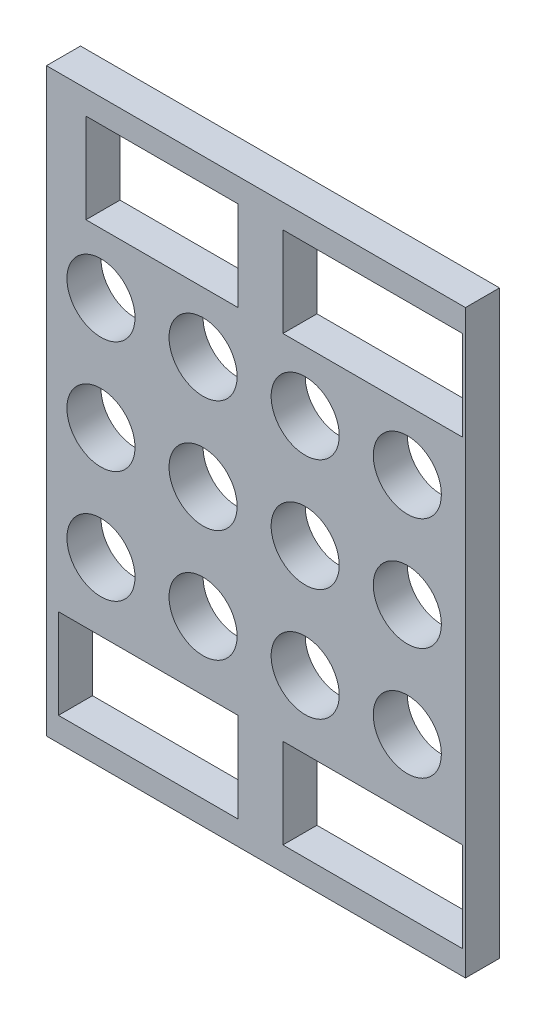
ISO-10303-21;
HEADER;
FILE_DESCRIPTION(('STEP AP214'),'2;1');
FILE_NAME('part.step','',(''),(''),'','','');
FILE_SCHEMA(('AUTOMOTIVE_DESIGN { 1 0 10303 214 1 1 1 1 }'));
ENDSEC;
DATA;
#1=APPLICATION_CONTEXT('core data for automotive mechanical design processes');
#2=APPLICATION_PROTOCOL_DEFINITION('international standard','automotive_design',2000,#1);
#3=PRODUCT_CONTEXT('',#1,'mechanical');
#4=PRODUCT('Part','Part','',(#3));
#5=PRODUCT_RELATED_PRODUCT_CATEGORY('part','',(#4));
#6=PRODUCT_DEFINITION_FORMATION('','',#4);
#7=PRODUCT_DEFINITION_CONTEXT('part definition',#1,'design');
#8=PRODUCT_DEFINITION('design','',#6,#7);
#9=PRODUCT_DEFINITION_SHAPE('','',#8);
#10=(LENGTH_UNIT() NAMED_UNIT(*) SI_UNIT(.MILLI.,.METRE.));
#11=(NAMED_UNIT(*) PLANE_ANGLE_UNIT() SI_UNIT($,.RADIAN.));
#12=(NAMED_UNIT(*) SI_UNIT($,.STERADIAN.) SOLID_ANGLE_UNIT());
#13=UNCERTAINTY_MEASURE_WITH_UNIT(LENGTH_MEASURE(1.E-05),#10,'distance_accuracy_value','');
#14=(GEOMETRIC_REPRESENTATION_CONTEXT(3) GLOBAL_UNCERTAINTY_ASSIGNED_CONTEXT((#13)) GLOBAL_UNIT_ASSIGNED_CONTEXT((#10,
#11,#12)) REPRESENTATION_CONTEXT('',''));
#15=CARTESIAN_POINT('',(0.,0.,0.));
#16=DIRECTION('',(0.,0.,1.));
#17=DIRECTION('',(1.,0.,0.));
#18=AXIS2_PLACEMENT_3D('',#15,#16,#17);
#19=CARTESIAN_POINT('',(0.,0.,5.));
#20=DIRECTION('',(0.,0.,1.));
#21=DIRECTION('',(1.,0.,0.));
#22=AXIS2_PLACEMENT_3D('',#19,#20,#21);
#23=PLANE('',#22);
#24=CARTESIAN_POINT('',(261.469054235882,375.54602981814,5.));
#25=DIRECTION('',(0.,0.,1.));
#26=DIRECTION('',(1.,0.,0.));
#27=AXIS2_PLACEMENT_3D('',#24,#25,#26);
#28=CIRCLE('',#27,4.99999999999999);
#29=CARTESIAN_POINT('',(266.469054235882,375.54602981814,5.));
#30=VERTEX_POINT('',#29);
#31=EDGE_CURVE('E457',#30,#30,#28,.T.);
#32=ORIENTED_EDGE('',*,*,#31,.F.);
#33=EDGE_LOOP('',(#32));
#34=FACE_BOUND('',#33,.T.);
#35=CARTESIAN_POINT('',(231.469054235882,375.54602981814,5.));
#36=DIRECTION('',(0.,0.,1.));
#37=DIRECTION('',(1.,0.,0.));
#38=AXIS2_PLACEMENT_3D('',#35,#36,#37);
#39=CIRCLE('',#38,4.99999999999999);
#40=CARTESIAN_POINT('',(236.469054235882,375.54602981814,5.));
#41=VERTEX_POINT('',#40);
#42=EDGE_CURVE('E465',#41,#41,#39,.T.);
#43=ORIENTED_EDGE('',*,*,#42,.F.);
#44=EDGE_LOOP('',(#43));
#45=FACE_BOUND('',#44,.T.);
#46=CARTESIAN_POINT('',(261.469054235882,392.04602981814,5.));
#47=DIRECTION('',(0.,0.,1.));
#48=DIRECTION('',(1.,0.,0.));
#49=AXIS2_PLACEMENT_3D('',#46,#47,#48);
#50=CIRCLE('',#49,4.99999999999999);
#51=CARTESIAN_POINT('',(266.469054235882,392.04602981814,5.));
#52=VERTEX_POINT('',#51);
#53=EDGE_CURVE('E473',#52,#52,#50,.T.);
#54=ORIENTED_EDGE('',*,*,#53,.F.);
#55=EDGE_LOOP('',(#54));
#56=FACE_BOUND('',#55,.T.);
#57=CARTESIAN_POINT('',(231.469054235882,392.04602981814,5.));
#58=DIRECTION('',(0.,0.,1.));
#59=DIRECTION('',(1.,0.,0.));
#60=AXIS2_PLACEMENT_3D('',#57,#58,#59);
#61=CIRCLE('',#60,4.99999999999999);
#62=CARTESIAN_POINT('',(236.469054235882,392.04602981814,5.));
#63=VERTEX_POINT('',#62);
#64=EDGE_CURVE('E207',#63,#63,#61,.T.);
#65=ORIENTED_EDGE('',*,*,#64,.F.);
#66=EDGE_LOOP('',(#65));
#67=FACE_BOUND('',#66,.T.);
#68=DIRECTION('',(1.,0.,0.));
#69=VECTOR('',#68,1.);
#70=CARTESIAN_POINT('',(258.196652630229,417.400325944062,5.));
#71=LINE('',#70,#69);
#72=CARTESIAN_POINT('',(258.196652630229,417.400325944062,5.));
#73=VERTEX_POINT('',#72);
#74=CARTESIAN_POINT('',(284.57204381581,417.400325944062,5.));
#75=VERTEX_POINT('',#74);
#76=EDGE_CURVE('E256',#73,#75,#71,.T.);
#77=ORIENTED_EDGE('',*,*,#76,.F.);
#78=DIRECTION('',(0.,-1.,0.));
#79=VECTOR('',#78,1.);
#80=CARTESIAN_POINT('',(258.196652630229,430.588021536852,5.));
#81=LINE('',#80,#79);
#82=CARTESIAN_POINT('',(258.196652630229,430.588021536852,5.));
#83=VERTEX_POINT('',#82);
#84=EDGE_CURVE('E254',#83,#73,#81,.T.);
#85=ORIENTED_EDGE('',*,*,#84,.F.);
#86=DIRECTION('',(-1.,0.,0.));
#87=VECTOR('',#86,1.);
#88=CARTESIAN_POINT('',(258.196652630229,430.588021536852,5.));
#89=LINE('',#88,#87);
#90=CARTESIAN_POINT('',(284.57204381581,430.588021536852,5.));
#91=VERTEX_POINT('',#90);
#92=EDGE_CURVE('E262',#91,#83,#89,.T.);
#93=ORIENTED_EDGE('',*,*,#92,.F.);
#94=DIRECTION('',(0.,1.,0.));
#95=VECTOR('',#94,1.);
#96=CARTESIAN_POINT('',(284.57204381581,430.588021536852,5.));
#97=LINE('',#96,#95);
#98=EDGE_CURVE('E259',#75,#91,#97,.T.);
#99=ORIENTED_EDGE('',*,*,#98,.F.);
#100=EDGE_LOOP('',(#77,#85,#93,#99));
#101=FACE_BOUND('',#100,.T.);
#102=CARTESIAN_POINT('',(261.469054235881,408.54602981814,5.));
#103=DIRECTION('',(0.,0.,1.));
#104=DIRECTION('',(1.,0.,0.));
#105=AXIS2_PLACEMENT_3D('',#102,#103,#104);
#106=CIRCLE('',#105,4.99999999999999);
#107=CARTESIAN_POINT('',(266.469054235881,408.54602981814,5.));
#108=VERTEX_POINT('',#107);
#109=EDGE_CURVE('E285',#108,#108,#106,.T.);
#110=ORIENTED_EDGE('',*,*,#109,.F.);
#111=EDGE_LOOP('',(#110));
#112=FACE_BOUND('',#111,.T.);
#113=CARTESIAN_POINT('',(231.469054235881,408.54602981814,5.));
#114=DIRECTION('',(0.,0.,1.));
#115=DIRECTION('',(1.,0.,0.));
#116=AXIS2_PLACEMENT_3D('',#113,#114,#115);
#117=CIRCLE('',#116,4.99999999999999);
#118=CARTESIAN_POINT('',(236.469054235881,408.54602981814,5.));
#119=VERTEX_POINT('',#118);
#120=EDGE_CURVE('E328',#119,#119,#117,.T.);
#121=ORIENTED_EDGE('',*,*,#120,.F.);
#122=EDGE_LOOP('',(#121));
#123=FACE_BOUND('',#122,.T.);
#124=DIRECTION('',(-1.,0.,0.));
#125=VECTOR('',#124,1.);
#126=CARTESIAN_POINT('',(285.011633668903,434.104740361596,5.));
#127=LINE('',#126,#125);
#128=CARTESIAN_POINT('',(285.011633668903,434.104740361596,5.));
#129=VERTEX_POINT('',#128);
#130=CARTESIAN_POINT('',(223.469054235881,434.104740361596,5.));
#131=VERTEX_POINT('',#130);
#132=EDGE_CURVE('E334',#129,#131,#127,.T.);
#133=ORIENTED_EDGE('',*,*,#132,.T.);
#134=DIRECTION('',(0.,-1.,0.));
#135=VECTOR('',#134,1.);
#136=CARTESIAN_POINT('',(223.469054235881,434.104740361596,5.));
#137=LINE('',#136,#135);
#138=CARTESIAN_POINT('',(223.469054235881,348.824308861552,5.));
#139=VERTEX_POINT('',#138);
#140=EDGE_CURVE('E337',#131,#139,#137,.T.);
#141=ORIENTED_EDGE('',*,*,#140,.T.);
#142=DIRECTION('',(1.,0.,0.));
#143=VECTOR('',#142,1.);
#144=CARTESIAN_POINT('',(223.469054235881,348.824308861552,5.));
#145=LINE('',#144,#143);
#146=CARTESIAN_POINT('',(285.011633668903,348.824308861552,5.));
#147=VERTEX_POINT('',#146);
#148=EDGE_CURVE('E340',#139,#147,#145,.T.);
#149=ORIENTED_EDGE('',*,*,#148,.T.);
#150=DIRECTION('',(0.,1.,0.));
#151=VECTOR('',#150,1.);
#152=CARTESIAN_POINT('',(285.011633668903,348.824308861552,5.));
#153=LINE('',#152,#151);
#154=EDGE_CURVE('E342',#147,#129,#153,.T.);
#155=ORIENTED_EDGE('',*,*,#154,.T.);
#156=EDGE_LOOP('',(#133,#141,#149,#155));
#157=FACE_BOUND('',#156,.T.);
#158=CARTESIAN_POINT('',(246.469054235881,408.54602981814,5.));
#159=DIRECTION('',(0.,0.,1.));
#160=DIRECTION('',(1.,0.,0.));
#161=AXIS2_PLACEMENT_3D('',#158,#159,#160);
#162=CIRCLE('',#161,4.99999999999999);
#163=CARTESIAN_POINT('',(251.469054235881,408.54602981814,5.));
#164=VERTEX_POINT('',#163);
#165=EDGE_CURVE('E322',#164,#164,#162,.T.);
#166=ORIENTED_EDGE('',*,*,#165,.F.);
#167=EDGE_LOOP('',(#166));
#168=FACE_BOUND('',#167,.T.);
#169=DIRECTION('',(1.,0.,0.));
#170=VECTOR('',#169,1.);
#171=CARTESIAN_POINT('',(229.265573278554,417.400325944062,5.));
#172=LINE('',#171,#170);
#173=CARTESIAN_POINT('',(229.265573278554,417.400325944062,5.));
#174=VERTEX_POINT('',#173);
#175=CARTESIAN_POINT('',(251.602804833834,417.400325944062,5.));
#176=VERTEX_POINT('',#175);
#177=EDGE_CURVE('E293',#174,#176,#172,.T.);
#178=ORIENTED_EDGE('',*,*,#177,.F.);
#179=DIRECTION('',(0.,-1.,0.));
#180=VECTOR('',#179,1.);
#181=CARTESIAN_POINT('',(229.265573278554,430.588021536852,5.));
#182=LINE('',#181,#180);
#183=CARTESIAN_POINT('',(229.265573278554,430.588021536852,5.));
#184=VERTEX_POINT('',#183);
#185=EDGE_CURVE('E291',#184,#174,#182,.T.);
#186=ORIENTED_EDGE('',*,*,#185,.F.);
#187=DIRECTION('',(-1.,0.,0.));
#188=VECTOR('',#187,1.);
#189=CARTESIAN_POINT('',(229.265573278554,430.588021536852,5.));
#190=LINE('',#189,#188);
#191=CARTESIAN_POINT('',(251.602804833834,430.588021536852,5.));
#192=VERTEX_POINT('',#191);
#193=EDGE_CURVE('E299',#192,#184,#190,.T.);
#194=ORIENTED_EDGE('',*,*,#193,.F.);
#195=DIRECTION('',(0.,1.,0.));
#196=VECTOR('',#195,1.);
#197=CARTESIAN_POINT('',(251.602804833834,430.588021536852,5.));
#198=LINE('',#197,#196);
#199=EDGE_CURVE('E296',#176,#192,#198,.T.);
#200=ORIENTED_EDGE('',*,*,#199,.F.);
#201=EDGE_LOOP('',(#178,#186,#194,#200));
#202=FACE_BOUND('',#201,.T.);
#203=CARTESIAN_POINT('',(276.469054235881,408.54602981814,5.));
#204=DIRECTION('',(0.,0.,1.));
#205=DIRECTION('',(1.,0.,0.));
#206=AXIS2_PLACEMENT_3D('',#203,#204,#205);
#207=CIRCLE('',#206,4.99999999999999);
#208=CARTESIAN_POINT('',(281.469054235881,408.54602981814,5.));
#209=VERTEX_POINT('',#208);
#210=EDGE_CURVE('E248',#209,#209,#207,.T.);
#211=ORIENTED_EDGE('',*,*,#210,.F.);
#212=EDGE_LOOP('',(#211));
#213=FACE_BOUND('',#212,.T.);
#214=DIRECTION('',(1.,0.,0.));
#215=VECTOR('',#214,1.);
#216=CARTESIAN_POINT('',(225.227413648254,352.341027686296,5.));
#217=LINE('',#216,#215);
#218=CARTESIAN_POINT('',(225.227413648254,352.341027686296,5.));
#219=VERTEX_POINT('',#218);
#220=CARTESIAN_POINT('',(251.602804833834,352.341027686296,5.));
#221=VERTEX_POINT('',#220);
#222=EDGE_CURVE('E219',#219,#221,#217,.T.);
#223=ORIENTED_EDGE('',*,*,#222,.F.);
#224=DIRECTION('',(0.,-1.,0.));
#225=VECTOR('',#224,1.);
#226=CARTESIAN_POINT('',(225.227413648254,365.528723279086,5.));
#227=LINE('',#226,#225);
#228=CARTESIAN_POINT('',(225.227413648254,365.528723279086,5.));
#229=VERTEX_POINT('',#228);
#230=EDGE_CURVE('E217',#229,#219,#227,.T.);
#231=ORIENTED_EDGE('',*,*,#230,.F.);
#232=DIRECTION('',(-1.,0.,0.));
#233=VECTOR('',#232,1.);
#234=CARTESIAN_POINT('',(225.227413648254,365.528723279086,5.));
#235=LINE('',#234,#233);
#236=CARTESIAN_POINT('',(251.602804833834,365.528723279086,5.));
#237=VERTEX_POINT('',#236);
#238=EDGE_CURVE('E225',#237,#229,#235,.T.);
#239=ORIENTED_EDGE('',*,*,#238,.F.);
#240=DIRECTION('',(0.,1.,0.));
#241=VECTOR('',#240,1.);
#242=CARTESIAN_POINT('',(251.602804833834,365.528723279086,5.));
#243=LINE('',#242,#241);
#244=EDGE_CURVE('E222',#221,#237,#243,.T.);
#245=ORIENTED_EDGE('',*,*,#244,.F.);
#246=EDGE_LOOP('',(#223,#231,#239,#245));
#247=FACE_BOUND('',#246,.T.);
#248=DIRECTION('',(1.,0.,0.));
#249=VECTOR('',#248,1.);
#250=CARTESIAN_POINT('',(258.196652630229,352.341027686296,5.));
#251=LINE('',#250,#249);
#252=CARTESIAN_POINT('',(258.196652630229,352.341027686296,5.));
#253=VERTEX_POINT('',#252);
#254=CARTESIAN_POINT('',(284.57204381581,352.341027686296,5.));
#255=VERTEX_POINT('',#254);
#256=EDGE_CURVE('E186',#253,#255,#251,.T.);
#257=ORIENTED_EDGE('',*,*,#256,.F.);
#258=DIRECTION('',(0.,-1.,0.));
#259=VECTOR('',#258,1.);
#260=CARTESIAN_POINT('',(258.196652630229,365.528723279086,5.));
#261=LINE('',#260,#259);
#262=CARTESIAN_POINT('',(258.196652630229,365.528723279086,5.));
#263=VERTEX_POINT('',#262);
#264=EDGE_CURVE('E178',#263,#253,#261,.T.);
#265=ORIENTED_EDGE('',*,*,#264,.F.);
#266=DIRECTION('',(-1.,0.,0.));
#267=VECTOR('',#266,1.);
#268=CARTESIAN_POINT('',(258.196652630229,365.528723279086,5.));
#269=LINE('',#268,#267);
#270=CARTESIAN_POINT('',(284.57204381581,365.528723279086,5.));
#271=VERTEX_POINT('',#270);
#272=EDGE_CURVE('E201',#271,#263,#269,.T.);
#273=ORIENTED_EDGE('',*,*,#272,.F.);
#274=DIRECTION('',(0.,1.,0.));
#275=VECTOR('',#274,1.);
#276=CARTESIAN_POINT('',(284.57204381581,365.528723279086,5.));
#277=LINE('',#276,#275);
#278=EDGE_CURVE('E199',#255,#271,#277,.T.);
#279=ORIENTED_EDGE('',*,*,#278,.F.);
#280=EDGE_LOOP('',(#257,#265,#273,#279));
#281=FACE_BOUND('',#280,.T.);
#282=CARTESIAN_POINT('',(246.469054235882,392.04602981814,5.));
#283=DIRECTION('',(0.,0.,1.));
#284=DIRECTION('',(1.,0.,0.));
#285=AXIS2_PLACEMENT_3D('',#282,#283,#284);
#286=CIRCLE('',#285,4.99999999999999);
#287=CARTESIAN_POINT('',(251.469054235882,392.04602981814,5.));
#288=VERTEX_POINT('',#287);
#289=EDGE_CURVE('E477',#288,#288,#286,.T.);
#290=ORIENTED_EDGE('',*,*,#289,.F.);
#291=EDGE_LOOP('',(#290));
#292=FACE_BOUND('',#291,.T.);
#293=CARTESIAN_POINT('',(276.469054235882,392.04602981814,5.));
#294=DIRECTION('',(0.,0.,1.));
#295=DIRECTION('',(1.,0.,0.));
#296=AXIS2_PLACEMENT_3D('',#293,#294,#295);
#297=CIRCLE('',#296,4.99999999999999);
#298=CARTESIAN_POINT('',(281.469054235882,392.04602981814,5.));
#299=VERTEX_POINT('',#298);
#300=EDGE_CURVE('E469',#299,#299,#297,.T.);
#301=ORIENTED_EDGE('',*,*,#300,.F.);
#302=EDGE_LOOP('',(#301));
#303=FACE_BOUND('',#302,.T.);
#304=CARTESIAN_POINT('',(246.469054235882,375.54602981814,5.));
#305=DIRECTION('',(0.,0.,1.));
#306=DIRECTION('',(1.,0.,0.));
#307=AXIS2_PLACEMENT_3D('',#304,#305,#306);
#308=CIRCLE('',#307,4.99999999999999);
#309=CARTESIAN_POINT('',(251.469054235882,375.54602981814,5.));
#310=VERTEX_POINT('',#309);
#311=EDGE_CURVE('E461',#310,#310,#308,.T.);
#312=ORIENTED_EDGE('',*,*,#311,.F.);
#313=EDGE_LOOP('',(#312));
#314=FACE_BOUND('',#313,.T.);
#315=CARTESIAN_POINT('',(276.469054235882,375.54602981814,5.));
#316=DIRECTION('',(0.,0.,1.));
#317=DIRECTION('',(1.,0.,0.));
#318=AXIS2_PLACEMENT_3D('',#315,#316,#317);
#319=CIRCLE('',#318,4.99999999999999);
#320=CARTESIAN_POINT('',(281.469054235882,375.54602981814,5.));
#321=VERTEX_POINT('',#320);
#322=EDGE_CURVE('E452',#321,#321,#319,.T.);
#323=ORIENTED_EDGE('',*,*,#322,.F.);
#324=EDGE_LOOP('',(#323));
#325=FACE_BOUND('',#324,.T.);
#326=ADVANCED_FACE('F41',(#34,#45,#56,#67,#101,#112,#123,#157,#168,#202,#213,#247,#281,#292,
#303,#314,#325),#23,.T.);
#327=CARTESIAN_POINT('',(0.,0.,0.));
#328=DIRECTION('',(0.,0.,1.));
#329=DIRECTION('',(1.,0.,0.));
#330=AXIS2_PLACEMENT_3D('',#327,#328,#329);
#331=PLANE('',#330);
#332=DIRECTION('',(0.,-1.,0.));
#333=VECTOR('',#332,1.);
#334=CARTESIAN_POINT('',(225.227413648254,365.528723279086,0.));
#335=LINE('',#334,#333);
#336=CARTESIAN_POINT('',(225.227413648254,365.528723279086,0.));
#337=VERTEX_POINT('',#336);
#338=CARTESIAN_POINT('',(225.227413648254,352.341027686296,0.));
#339=VERTEX_POINT('',#338);
#340=EDGE_CURVE('E194',#337,#339,#335,.T.);
#341=ORIENTED_EDGE('',*,*,#340,.T.);
#342=DIRECTION('',(1.,0.,0.));
#343=VECTOR('',#342,1.);
#344=CARTESIAN_POINT('',(225.227413648254,352.341027686296,0.));
#345=LINE('',#344,#343);
#346=CARTESIAN_POINT('',(251.602804833834,352.341027686296,0.));
#347=VERTEX_POINT('',#346);
#348=EDGE_CURVE('E230',#339,#347,#345,.T.);
#349=ORIENTED_EDGE('',*,*,#348,.T.);
#350=DIRECTION('',(0.,1.,0.));
#351=VECTOR('',#350,1.);
#352=CARTESIAN_POINT('',(251.602804833834,365.528723279086,0.));
#353=LINE('',#352,#351);
#354=CARTESIAN_POINT('',(251.602804833834,365.528723279086,0.));
#355=VERTEX_POINT('',#354);
#356=EDGE_CURVE('E233',#347,#355,#353,.T.);
#357=ORIENTED_EDGE('',*,*,#356,.T.);
#358=DIRECTION('',(-1.,0.,0.));
#359=VECTOR('',#358,1.);
#360=CARTESIAN_POINT('',(225.227413648254,365.528723279086,0.));
#361=LINE('',#360,#359);
#362=EDGE_CURVE('E220',#355,#337,#361,.T.);
#363=ORIENTED_EDGE('',*,*,#362,.T.);
#364=EDGE_LOOP('',(#341,#349,#357,#363));
#365=FACE_BOUND('',#364,.T.);
#366=CARTESIAN_POINT('',(261.469054235881,408.54602981814,0.));
#367=DIRECTION('',(0.,0.,1.));
#368=DIRECTION('',(1.,0.,0.));
#369=AXIS2_PLACEMENT_3D('',#366,#367,#368);
#370=CIRCLE('',#369,4.99999999999999);
#371=CARTESIAN_POINT('',(266.469054235881,408.54602981814,0.));
#372=VERTEX_POINT('',#371);
#373=EDGE_CURVE('E284',#372,#372,#370,.T.);
#374=ORIENTED_EDGE('',*,*,#373,.T.);
#375=EDGE_LOOP('',(#374));
#376=FACE_BOUND('',#375,.T.);
#377=DIRECTION('',(0.,-1.,0.));
#378=VECTOR('',#377,1.);
#379=CARTESIAN_POINT('',(229.265573278554,430.588021536852,0.));
#380=LINE('',#379,#378);
#381=CARTESIAN_POINT('',(229.265573278554,430.588021536852,0.));
#382=VERTEX_POINT('',#381);
#383=CARTESIAN_POINT('',(229.265573278554,417.400325944062,0.));
#384=VERTEX_POINT('',#383);
#385=EDGE_CURVE('E288',#382,#384,#380,.T.);
#386=ORIENTED_EDGE('',*,*,#385,.T.);
#387=DIRECTION('',(1.,0.,0.));
#388=VECTOR('',#387,1.);
#389=CARTESIAN_POINT('',(229.265573278554,417.400325944062,0.));
#390=LINE('',#389,#388);
#391=CARTESIAN_POINT('',(251.602804833834,417.400325944062,0.));
#392=VERTEX_POINT('',#391);
#393=EDGE_CURVE('E304',#384,#392,#390,.T.);
#394=ORIENTED_EDGE('',*,*,#393,.T.);
#395=DIRECTION('',(0.,1.,0.));
#396=VECTOR('',#395,1.);
#397=CARTESIAN_POINT('',(251.602804833834,430.588021536852,0.));
#398=LINE('',#397,#396);
#399=CARTESIAN_POINT('',(251.602804833834,430.588021536852,0.));
#400=VERTEX_POINT('',#399);
#401=EDGE_CURVE('E307',#392,#400,#398,.T.);
#402=ORIENTED_EDGE('',*,*,#401,.T.);
#403=DIRECTION('',(-1.,0.,0.));
#404=VECTOR('',#403,1.);
#405=CARTESIAN_POINT('',(229.265573278554,430.588021536852,0.));
#406=LINE('',#405,#404);
#407=EDGE_CURVE('E294',#400,#382,#406,.T.);
#408=ORIENTED_EDGE('',*,*,#407,.T.);
#409=EDGE_LOOP('',(#386,#394,#402,#408));
#410=FACE_BOUND('',#409,.T.);
#411=DIRECTION('',(-1.,0.,0.));
#412=VECTOR('',#411,1.);
#413=CARTESIAN_POINT('',(285.011633668903,434.104740361596,0.));
#414=LINE('',#413,#412);
#415=CARTESIAN_POINT('',(285.011633668903,434.104740361596,0.));
#416=VERTEX_POINT('',#415);
#417=CARTESIAN_POINT('',(223.469054235881,434.104740361596,0.));
#418=VERTEX_POINT('',#417);
#419=EDGE_CURVE('E331',#416,#418,#414,.T.);
#420=ORIENTED_EDGE('',*,*,#419,.F.);
#421=DIRECTION('',(0.,1.,0.));
#422=VECTOR('',#421,1.);
#423=CARTESIAN_POINT('',(285.011633668903,348.824308861552,0.));
#424=LINE('',#423,#422);
#425=CARTESIAN_POINT('',(285.011633668903,348.824308861552,0.));
#426=VERTEX_POINT('',#425);
#427=EDGE_CURVE('E338',#426,#416,#424,.T.);
#428=ORIENTED_EDGE('',*,*,#427,.F.);
#429=DIRECTION('',(1.,0.,0.));
#430=VECTOR('',#429,1.);
#431=CARTESIAN_POINT('',(223.469054235881,348.824308861552,0.));
#432=LINE('',#431,#430);
#433=CARTESIAN_POINT('',(223.469054235881,348.824308861552,0.));
#434=VERTEX_POINT('',#433);
#435=EDGE_CURVE('E349',#434,#426,#432,.T.);
#436=ORIENTED_EDGE('',*,*,#435,.F.);
#437=DIRECTION('',(0.,-1.,0.));
#438=VECTOR('',#437,1.);
#439=CARTESIAN_POINT('',(223.469054235881,434.104740361596,0.));
#440=LINE('',#439,#438);
#441=EDGE_CURVE('E347',#418,#434,#440,.T.);
#442=ORIENTED_EDGE('',*,*,#441,.F.);
#443=EDGE_LOOP('',(#420,#428,#436,#442));
#444=FACE_BOUND('',#443,.T.);
#445=CARTESIAN_POINT('',(231.469054235881,408.54602981814,0.));
#446=DIRECTION('',(0.,0.,1.));
#447=DIRECTION('',(1.,0.,0.));
#448=AXIS2_PLACEMENT_3D('',#445,#446,#447);
#449=CIRCLE('',#448,4.99999999999999);
#450=CARTESIAN_POINT('',(236.469054235881,408.54602981814,0.));
#451=VERTEX_POINT('',#450);
#452=EDGE_CURVE('E325',#451,#451,#449,.T.);
#453=ORIENTED_EDGE('',*,*,#452,.T.);
#454=EDGE_LOOP('',(#453));
#455=FACE_BOUND('',#454,.T.);
#456=CARTESIAN_POINT('',(246.469054235881,408.54602981814,0.));
#457=DIRECTION('',(0.,0.,1.));
#458=DIRECTION('',(1.,0.,0.));
#459=AXIS2_PLACEMENT_3D('',#456,#457,#458);
#460=CIRCLE('',#459,4.99999999999999);
#461=CARTESIAN_POINT('',(251.469054235881,408.54602981814,0.));
#462=VERTEX_POINT('',#461);
#463=EDGE_CURVE('E321',#462,#462,#460,.T.);
#464=ORIENTED_EDGE('',*,*,#463,.T.);
#465=EDGE_LOOP('',(#464));
#466=FACE_BOUND('',#465,.T.);
#467=DIRECTION('',(0.,-1.,0.));
#468=VECTOR('',#467,1.);
#469=CARTESIAN_POINT('',(258.196652630229,430.588021536852,0.));
#470=LINE('',#469,#468);
#471=CARTESIAN_POINT('',(258.196652630229,430.588021536852,0.));
#472=VERTEX_POINT('',#471);
#473=CARTESIAN_POINT('',(258.196652630229,417.400325944062,0.));
#474=VERTEX_POINT('',#473);
#475=EDGE_CURVE('E251',#472,#474,#470,.T.);
#476=ORIENTED_EDGE('',*,*,#475,.T.);
#477=DIRECTION('',(1.,0.,0.));
#478=VECTOR('',#477,1.);
#479=CARTESIAN_POINT('',(258.196652630229,417.400325944062,0.));
#480=LINE('',#479,#478);
#481=CARTESIAN_POINT('',(284.57204381581,417.400325944062,0.));
#482=VERTEX_POINT('',#481);
#483=EDGE_CURVE('E267',#474,#482,#480,.T.);
#484=ORIENTED_EDGE('',*,*,#483,.T.);
#485=DIRECTION('',(0.,1.,0.));
#486=VECTOR('',#485,1.);
#487=CARTESIAN_POINT('',(284.57204381581,430.588021536852,0.));
#488=LINE('',#487,#486);
#489=CARTESIAN_POINT('',(284.57204381581,430.588021536852,0.));
#490=VERTEX_POINT('',#489);
#491=EDGE_CURVE('E270',#482,#490,#488,.T.);
#492=ORIENTED_EDGE('',*,*,#491,.T.);
#493=DIRECTION('',(-1.,0.,0.));
#494=VECTOR('',#493,1.);
#495=CARTESIAN_POINT('',(258.196652630229,430.588021536852,0.));
#496=LINE('',#495,#494);
#497=EDGE_CURVE('E257',#490,#472,#496,.T.);
#498=ORIENTED_EDGE('',*,*,#497,.T.);
#499=EDGE_LOOP('',(#476,#484,#492,#498));
#500=FACE_BOUND('',#499,.T.);
#501=CARTESIAN_POINT('',(276.469054235881,408.54602981814,0.));
#502=DIRECTION('',(0.,0.,1.));
#503=DIRECTION('',(1.,0.,0.));
#504=AXIS2_PLACEMENT_3D('',#501,#502,#503);
#505=CIRCLE('',#504,4.99999999999999);
#506=CARTESIAN_POINT('',(281.469054235881,408.54602981814,0.));
#507=VERTEX_POINT('',#506);
#508=EDGE_CURVE('E247',#507,#507,#505,.T.);
#509=ORIENTED_EDGE('',*,*,#508,.T.);
#510=EDGE_LOOP('',(#509));
#511=FACE_BOUND('',#510,.T.);
#512=DIRECTION('',(0.,-1.,0.));
#513=VECTOR('',#512,1.);
#514=CARTESIAN_POINT('',(258.196652630229,365.528723279086,0.));
#515=LINE('',#514,#513);
#516=CARTESIAN_POINT('',(258.196652630229,365.528723279086,0.));
#517=VERTEX_POINT('',#516);
#518=CARTESIAN_POINT('',(258.196652630229,352.341027686296,0.));
#519=VERTEX_POINT('',#518);
#520=EDGE_CURVE('E64',#517,#519,#515,.T.);
#521=ORIENTED_EDGE('',*,*,#520,.T.);
#522=DIRECTION('',(1.,0.,0.));
#523=VECTOR('',#522,1.);
#524=CARTESIAN_POINT('',(258.196652630229,352.341027686296,0.));
#525=LINE('',#524,#523);
#526=CARTESIAN_POINT('',(284.57204381581,352.341027686296,0.));
#527=VERTEX_POINT('',#526);
#528=EDGE_CURVE('E193',#519,#527,#525,.T.);
#529=ORIENTED_EDGE('',*,*,#528,.T.);
#530=DIRECTION('',(0.,1.,0.));
#531=VECTOR('',#530,1.);
#532=CARTESIAN_POINT('',(284.57204381581,365.528723279086,0.));
#533=LINE('',#532,#531);
#534=CARTESIAN_POINT('',(284.57204381581,365.528723279086,0.));
#535=VERTEX_POINT('',#534);
#536=EDGE_CURVE('E209',#527,#535,#533,.T.);
#537=ORIENTED_EDGE('',*,*,#536,.T.);
#538=DIRECTION('',(-1.,0.,0.));
#539=VECTOR('',#538,1.);
#540=CARTESIAN_POINT('',(258.196652630229,365.528723279086,0.));
#541=LINE('',#540,#539);
#542=EDGE_CURVE('E187',#535,#517,#541,.T.);
#543=ORIENTED_EDGE('',*,*,#542,.T.);
#544=EDGE_LOOP('',(#521,#529,#537,#543));
#545=FACE_BOUND('',#544,.T.);
#546=CARTESIAN_POINT('',(231.469054235882,392.04602981814,0.));
#547=DIRECTION('',(0.,0.,1.));
#548=DIRECTION('',(1.,0.,0.));
#549=AXIS2_PLACEMENT_3D('',#546,#547,#548);
#550=CIRCLE('',#549,4.99999999999999);
#551=CARTESIAN_POINT('',(236.469054235882,392.04602981814,0.));
#552=VERTEX_POINT('',#551);
#553=EDGE_CURVE('E423',#552,#552,#550,.T.);
#554=ORIENTED_EDGE('',*,*,#553,.T.);
#555=EDGE_LOOP('',(#554));
#556=FACE_BOUND('',#555,.T.);
#557=CARTESIAN_POINT('',(246.469054235882,392.04602981814,0.));
#558=DIRECTION('',(0.,0.,1.));
#559=DIRECTION('',(1.,0.,0.));
#560=AXIS2_PLACEMENT_3D('',#557,#558,#559);
#561=CIRCLE('',#560,4.99999999999999);
#562=CARTESIAN_POINT('',(251.469054235882,392.04602981814,0.));
#563=VERTEX_POINT('',#562);
#564=EDGE_CURVE('E427',#563,#563,#561,.T.);
#565=ORIENTED_EDGE('',*,*,#564,.T.);
#566=EDGE_LOOP('',(#565));
#567=FACE_BOUND('',#566,.T.);
#568=CARTESIAN_POINT('',(261.469054235882,392.04602981814,0.));
#569=DIRECTION('',(0.,0.,1.));
#570=DIRECTION('',(1.,0.,0.));
#571=AXIS2_PLACEMENT_3D('',#568,#569,#570);
#572=CIRCLE('',#571,4.99999999999999);
#573=CARTESIAN_POINT('',(266.469054235882,392.04602981814,0.));
#574=VERTEX_POINT('',#573);
#575=EDGE_CURVE('E431',#574,#574,#572,.T.);
#576=ORIENTED_EDGE('',*,*,#575,.T.);
#577=EDGE_LOOP('',(#576));
#578=FACE_BOUND('',#577,.T.);
#579=CARTESIAN_POINT('',(276.469054235882,392.04602981814,0.));
#580=DIRECTION('',(0.,0.,1.));
#581=DIRECTION('',(1.,0.,0.));
#582=AXIS2_PLACEMENT_3D('',#579,#580,#581);
#583=CIRCLE('',#582,4.99999999999999);
#584=CARTESIAN_POINT('',(281.469054235882,392.04602981814,0.));
#585=VERTEX_POINT('',#584);
#586=EDGE_CURVE('E435',#585,#585,#583,.T.);
#587=ORIENTED_EDGE('',*,*,#586,.T.);
#588=EDGE_LOOP('',(#587));
#589=FACE_BOUND('',#588,.T.);
#590=CARTESIAN_POINT('',(231.469054235882,375.54602981814,0.));
#591=DIRECTION('',(0.,0.,1.));
#592=DIRECTION('',(1.,0.,0.));
#593=AXIS2_PLACEMENT_3D('',#590,#591,#592);
#594=CIRCLE('',#593,4.99999999999999);
#595=CARTESIAN_POINT('',(236.469054235882,375.54602981814,0.));
#596=VERTEX_POINT('',#595);
#597=EDGE_CURVE('E439',#596,#596,#594,.T.);
#598=ORIENTED_EDGE('',*,*,#597,.T.);
#599=EDGE_LOOP('',(#598));
#600=FACE_BOUND('',#599,.T.);
#601=CARTESIAN_POINT('',(246.469054235882,375.54602981814,0.));
#602=DIRECTION('',(0.,0.,1.));
#603=DIRECTION('',(1.,0.,0.));
#604=AXIS2_PLACEMENT_3D('',#601,#602,#603);
#605=CIRCLE('',#604,4.99999999999999);
#606=CARTESIAN_POINT('',(251.469054235882,375.54602981814,0.));
#607=VERTEX_POINT('',#606);
#608=EDGE_CURVE('E443',#607,#607,#605,.T.);
#609=ORIENTED_EDGE('',*,*,#608,.T.);
#610=EDGE_LOOP('',(#609));
#611=FACE_BOUND('',#610,.T.);
#612=CARTESIAN_POINT('',(261.469054235882,375.54602981814,0.));
#613=DIRECTION('',(0.,0.,1.));
#614=DIRECTION('',(1.,0.,0.));
#615=AXIS2_PLACEMENT_3D('',#612,#613,#614);
#616=CIRCLE('',#615,4.99999999999999);
#617=CARTESIAN_POINT('',(266.469054235882,375.54602981814,0.));
#618=VERTEX_POINT('',#617);
#619=EDGE_CURVE('E447',#618,#618,#616,.T.);
#620=ORIENTED_EDGE('',*,*,#619,.T.);
#621=EDGE_LOOP('',(#620));
#622=FACE_BOUND('',#621,.T.);
#623=CARTESIAN_POINT('',(276.469054235882,375.54602981814,0.));
#624=DIRECTION('',(0.,0.,1.));
#625=DIRECTION('',(1.,0.,0.));
#626=AXIS2_PLACEMENT_3D('',#623,#624,#625);
#627=CIRCLE('',#626,4.99999999999999);
#628=CARTESIAN_POINT('',(281.469054235882,375.54602981814,0.));
#629=VERTEX_POINT('',#628);
#630=EDGE_CURVE('E450',#629,#629,#627,.T.);
#631=ORIENTED_EDGE('',*,*,#630,.T.);
#632=EDGE_LOOP('',(#631));
#633=FACE_BOUND('',#632,.T.);
#634=ADVANCED_FACE('F367',(#365,#376,#410,#444,#455,#466,#500,#511,#545,#556,#567,#578,#589,
#600,#611,#622,#633),#331,.F.);
#635=CARTESIAN_POINT('',(285.011633668903,434.104740361596,5.));
#636=DIRECTION('',(0.,-1.,0.));
#637=DIRECTION('',(1.,0.,0.));
#638=AXIS2_PLACEMENT_3D('',#635,#636,#637);
#639=PLANE('',#638);
#640=ORIENTED_EDGE('',*,*,#419,.T.);
#641=DIRECTION('',(0.,0.,-1.));
#642=VECTOR('',#641,1.);
#643=CARTESIAN_POINT('',(223.469054235881,434.104740361596,5.));
#644=LINE('',#643,#642);
#645=EDGE_CURVE('E11',#131,#418,#644,.T.);
#646=ORIENTED_EDGE('',*,*,#645,.F.);
#647=ORIENTED_EDGE('',*,*,#132,.F.);
#648=DIRECTION('',(0.,0.,-1.));
#649=VECTOR('',#648,1.);
#650=CARTESIAN_POINT('',(285.011633668903,434.104740361596,5.));
#651=LINE('',#650,#649);
#652=EDGE_CURVE('E344',#129,#416,#651,.T.);
#653=ORIENTED_EDGE('',*,*,#652,.T.);
#654=EDGE_LOOP('',(#640,#646,#647,#653));
#655=FACE_BOUND('',#654,.T.);
#656=ADVANCED_FACE('F43',(#655),#639,.F.);
#657=CARTESIAN_POINT('',(223.469054235881,434.104740361596,5.));
#658=DIRECTION('',(1.,0.,0.));
#659=DIRECTION('',(0.,0.,-1.));
#660=AXIS2_PLACEMENT_3D('',#657,#658,#659);
#661=PLANE('',#660);
#662=ORIENTED_EDGE('',*,*,#441,.T.);
#663=DIRECTION('',(0.,0.,-1.));
#664=VECTOR('',#663,1.);
#665=CARTESIAN_POINT('',(223.469054235881,348.824308861552,5.));
#666=LINE('',#665,#664);
#667=EDGE_CURVE('E49',#139,#434,#666,.T.);
#668=ORIENTED_EDGE('',*,*,#667,.F.);
#669=ORIENTED_EDGE('',*,*,#140,.F.);
#670=ORIENTED_EDGE('',*,*,#645,.T.);
#671=EDGE_LOOP('',(#662,#668,#669,#670));
#672=FACE_BOUND('',#671,.T.);
#673=ADVANCED_FACE('F378',(#672),#661,.F.);
#674=CARTESIAN_POINT('',(223.469054235881,348.824308861552,5.));
#675=DIRECTION('',(0.,1.,0.));
#676=DIRECTION('',(0.,0.,1.));
#677=AXIS2_PLACEMENT_3D('',#674,#675,#676);
#678=PLANE('',#677);
#679=ORIENTED_EDGE('',*,*,#435,.T.);
#680=DIRECTION('',(0.,0.,-1.));
#681=VECTOR('',#680,1.);
#682=CARTESIAN_POINT('',(285.011633668903,348.824308861552,5.));
#683=LINE('',#682,#681);
#684=EDGE_CURVE('E354',#147,#426,#683,.T.);
#685=ORIENTED_EDGE('',*,*,#684,.F.);
#686=ORIENTED_EDGE('',*,*,#148,.F.);
#687=ORIENTED_EDGE('',*,*,#667,.T.);
#688=EDGE_LOOP('',(#679,#685,#686,#687));
#689=FACE_BOUND('',#688,.T.);
#690=ADVANCED_FACE('F361',(#689),#678,.F.);
#691=CARTESIAN_POINT('',(285.011633668903,348.824308861552,5.));
#692=DIRECTION('',(-1.,0.,0.));
#693=DIRECTION('',(0.,0.,1.));
#694=AXIS2_PLACEMENT_3D('',#691,#692,#693);
#695=PLANE('',#694);
#696=ORIENTED_EDGE('',*,*,#427,.T.);
#697=ORIENTED_EDGE('',*,*,#652,.F.);
#698=ORIENTED_EDGE('',*,*,#154,.F.);
#699=ORIENTED_EDGE('',*,*,#684,.T.);
#700=EDGE_LOOP('',(#696,#697,#698,#699));
#701=FACE_BOUND('',#700,.T.);
#702=ADVANCED_FACE('F371',(#701),#695,.F.);
#703=CARTESIAN_POINT('',(231.469054235881,408.54602981814,5.));
#704=DIRECTION('',(0.,0.,-1.));
#705=DIRECTION('',(-1.,0.,0.));
#706=AXIS2_PLACEMENT_3D('',#703,#704,#705);
#707=CYLINDRICAL_SURFACE('',#706,4.99999999999999);
#708=ORIENTED_EDGE('',*,*,#120,.T.);
#709=EDGE_LOOP('',(#708));
#710=FACE_BOUND('',#709,.T.);
#711=ORIENTED_EDGE('',*,*,#452,.F.);
#712=EDGE_LOOP('',(#711));
#713=FACE_BOUND('',#712,.T.);
#714=ADVANCED_FACE('F396',(#710,#713),#707,.F.);
#715=CARTESIAN_POINT('',(246.469054235881,408.54602981814,5.));
#716=DIRECTION('',(0.,0.,-1.));
#717=DIRECTION('',(-1.,0.,0.));
#718=AXIS2_PLACEMENT_3D('',#715,#716,#717);
#719=CYLINDRICAL_SURFACE('',#718,4.99999999999999);
#720=ORIENTED_EDGE('',*,*,#165,.T.);
#721=EDGE_LOOP('',(#720));
#722=FACE_BOUND('',#721,.T.);
#723=ORIENTED_EDGE('',*,*,#463,.F.);
#724=EDGE_LOOP('',(#723));
#725=FACE_BOUND('',#724,.T.);
#726=ADVANCED_FACE('F403',(#722,#725),#719,.F.);
#727=CARTESIAN_POINT('',(229.265573278554,430.588021536852,5.));
#728=DIRECTION('',(1.,0.,0.));
#729=DIRECTION('',(0.,0.,-1.));
#730=AXIS2_PLACEMENT_3D('',#727,#728,#729);
#731=PLANE('',#730);
#732=ORIENTED_EDGE('',*,*,#385,.F.);
#733=DIRECTION('',(0.,0.,-1.));
#734=VECTOR('',#733,1.);
#735=CARTESIAN_POINT('',(229.265573278554,430.588021536852,5.));
#736=LINE('',#735,#734);
#737=EDGE_CURVE('E301',#184,#382,#736,.T.);
#738=ORIENTED_EDGE('',*,*,#737,.F.);
#739=ORIENTED_EDGE('',*,*,#185,.T.);
#740=DIRECTION('',(0.,0.,-1.));
#741=VECTOR('',#740,1.);
#742=CARTESIAN_POINT('',(229.265573278554,417.400325944062,5.));
#743=LINE('',#742,#741);
#744=EDGE_CURVE('E318',#174,#384,#743,.T.);
#745=ORIENTED_EDGE('',*,*,#744,.T.);
#746=EDGE_LOOP('',(#732,#738,#739,#745));
#747=FACE_BOUND('',#746,.T.);
#748=ADVANCED_FACE('F408',(#747),#731,.T.);
#749=CARTESIAN_POINT('',(229.265573278554,417.400325944062,5.));
#750=DIRECTION('',(0.,1.,0.));
#751=DIRECTION('',(0.,0.,1.));
#752=AXIS2_PLACEMENT_3D('',#749,#750,#751);
#753=PLANE('',#752);
#754=ORIENTED_EDGE('',*,*,#393,.F.);
#755=ORIENTED_EDGE('',*,*,#744,.F.);
#756=ORIENTED_EDGE('',*,*,#177,.T.);
#757=DIRECTION('',(0.,0.,-1.));
#758=VECTOR('',#757,1.);
#759=CARTESIAN_POINT('',(251.602804833834,417.400325944062,5.));
#760=LINE('',#759,#758);
#761=EDGE_CURVE('E316',#176,#392,#760,.T.);
#762=ORIENTED_EDGE('',*,*,#761,.T.);
#763=EDGE_LOOP('',(#754,#755,#756,#762));
#764=FACE_BOUND('',#763,.T.);
#765=ADVANCED_FACE('F516',(#764),#753,.T.);
#766=CARTESIAN_POINT('',(251.602804833834,430.588021536852,5.));
#767=DIRECTION('',(-1.,0.,0.));
#768=DIRECTION('',(0.,0.,1.));
#769=AXIS2_PLACEMENT_3D('',#766,#767,#768);
#770=PLANE('',#769);
#771=ORIENTED_EDGE('',*,*,#401,.F.);
#772=ORIENTED_EDGE('',*,*,#761,.F.);
#773=ORIENTED_EDGE('',*,*,#199,.T.);
#774=DIRECTION('',(0.,0.,-1.));
#775=VECTOR('',#774,1.);
#776=CARTESIAN_POINT('',(251.602804833834,430.588021536852,5.));
#777=LINE('',#776,#775);
#778=EDGE_CURVE('E314',#192,#400,#777,.T.);
#779=ORIENTED_EDGE('',*,*,#778,.T.);
#780=EDGE_LOOP('',(#771,#772,#773,#779));
#781=FACE_BOUND('',#780,.T.);
#782=ADVANCED_FACE('F520',(#781),#770,.T.);
#783=CARTESIAN_POINT('',(229.265573278554,430.588021536852,5.));
#784=DIRECTION('',(0.,-1.,0.));
#785=DIRECTION('',(0.,0.,-1.));
#786=AXIS2_PLACEMENT_3D('',#783,#784,#785);
#787=PLANE('',#786);
#788=ORIENTED_EDGE('',*,*,#407,.F.);
#789=ORIENTED_EDGE('',*,*,#778,.F.);
#790=ORIENTED_EDGE('',*,*,#193,.T.);
#791=ORIENTED_EDGE('',*,*,#737,.T.);
#792=EDGE_LOOP('',(#788,#789,#790,#791));
#793=FACE_BOUND('',#792,.T.);
#794=ADVANCED_FACE('F499',(#793),#787,.T.);
#795=CARTESIAN_POINT('',(261.469054235881,408.54602981814,5.));
#796=DIRECTION('',(0.,0.,-1.));
#797=DIRECTION('',(-1.,0.,0.));
#798=AXIS2_PLACEMENT_3D('',#795,#796,#797);
#799=CYLINDRICAL_SURFACE('',#798,4.99999999999999);
#800=ORIENTED_EDGE('',*,*,#109,.T.);
#801=EDGE_LOOP('',(#800));
#802=FACE_BOUND('',#801,.T.);
#803=ORIENTED_EDGE('',*,*,#373,.F.);
#804=EDGE_LOOP('',(#803));
#805=FACE_BOUND('',#804,.T.);
#806=ADVANCED_FACE('F495',(#802,#805),#799,.F.);
#807=CARTESIAN_POINT('',(258.196652630229,430.588021536852,5.));
#808=DIRECTION('',(1.,0.,0.));
#809=DIRECTION('',(0.,0.,-1.));
#810=AXIS2_PLACEMENT_3D('',#807,#808,#809);
#811=PLANE('',#810);
#812=ORIENTED_EDGE('',*,*,#475,.F.);
#813=DIRECTION('',(0.,0.,-1.));
#814=VECTOR('',#813,1.);
#815=CARTESIAN_POINT('',(258.196652630229,430.588021536852,5.));
#816=LINE('',#815,#814);
#817=EDGE_CURVE('E264',#83,#472,#816,.T.);
#818=ORIENTED_EDGE('',*,*,#817,.F.);
#819=ORIENTED_EDGE('',*,*,#84,.T.);
#820=DIRECTION('',(0.,0.,-1.));
#821=VECTOR('',#820,1.);
#822=CARTESIAN_POINT('',(258.196652630229,417.400325944062,5.));
#823=LINE('',#822,#821);
#824=EDGE_CURVE('E281',#73,#474,#823,.T.);
#825=ORIENTED_EDGE('',*,*,#824,.T.);
#826=EDGE_LOOP('',(#812,#818,#819,#825));
#827=FACE_BOUND('',#826,.T.);
#828=ADVANCED_FACE('F498',(#827),#811,.T.);
#829=CARTESIAN_POINT('',(258.196652630229,417.400325944062,5.));
#830=DIRECTION('',(0.,1.,0.));
#831=DIRECTION('',(0.,0.,1.));
#832=AXIS2_PLACEMENT_3D('',#829,#830,#831);
#833=PLANE('',#832);
#834=ORIENTED_EDGE('',*,*,#483,.F.);
#835=ORIENTED_EDGE('',*,*,#824,.F.);
#836=ORIENTED_EDGE('',*,*,#76,.T.);
#837=DIRECTION('',(0.,0.,-1.));
#838=VECTOR('',#837,1.);
#839=CARTESIAN_POINT('',(284.57204381581,417.400325944062,5.));
#840=LINE('',#839,#838);
#841=EDGE_CURVE('E279',#75,#482,#840,.T.);
#842=ORIENTED_EDGE('',*,*,#841,.T.);
#843=EDGE_LOOP('',(#834,#835,#836,#842));
#844=FACE_BOUND('',#843,.T.);
#845=ADVANCED_FACE('F566',(#844),#833,.T.);
#846=CARTESIAN_POINT('',(284.57204381581,430.588021536852,5.));
#847=DIRECTION('',(-1.,0.,0.));
#848=DIRECTION('',(0.,0.,1.));
#849=AXIS2_PLACEMENT_3D('',#846,#847,#848);
#850=PLANE('',#849);
#851=ORIENTED_EDGE('',*,*,#491,.F.);
#852=ORIENTED_EDGE('',*,*,#841,.F.);
#853=ORIENTED_EDGE('',*,*,#98,.T.);
#854=DIRECTION('',(0.,0.,-1.));
#855=VECTOR('',#854,1.);
#856=CARTESIAN_POINT('',(284.57204381581,430.588021536852,5.));
#857=LINE('',#856,#855);
#858=EDGE_CURVE('E277',#91,#490,#857,.T.);
#859=ORIENTED_EDGE('',*,*,#858,.T.);
#860=EDGE_LOOP('',(#851,#852,#853,#859));
#861=FACE_BOUND('',#860,.T.);
#862=ADVANCED_FACE('F576',(#861),#850,.T.);
#863=CARTESIAN_POINT('',(258.196652630229,430.588021536852,5.));
#864=DIRECTION('',(0.,-1.,0.));
#865=DIRECTION('',(0.,0.,-1.));
#866=AXIS2_PLACEMENT_3D('',#863,#864,#865);
#867=PLANE('',#866);
#868=ORIENTED_EDGE('',*,*,#497,.F.);
#869=ORIENTED_EDGE('',*,*,#858,.F.);
#870=ORIENTED_EDGE('',*,*,#92,.T.);
#871=ORIENTED_EDGE('',*,*,#817,.T.);
#872=EDGE_LOOP('',(#868,#869,#870,#871));
#873=FACE_BOUND('',#872,.T.);
#874=ADVANCED_FACE('F586',(#873),#867,.T.);
#875=CARTESIAN_POINT('',(276.469054235881,408.54602981814,5.));
#876=DIRECTION('',(0.,0.,-1.));
#877=DIRECTION('',(-1.,0.,0.));
#878=AXIS2_PLACEMENT_3D('',#875,#876,#877);
#879=CYLINDRICAL_SURFACE('',#878,4.99999999999999);
#880=ORIENTED_EDGE('',*,*,#210,.T.);
#881=EDGE_LOOP('',(#880));
#882=FACE_BOUND('',#881,.T.);
#883=ORIENTED_EDGE('',*,*,#508,.F.);
#884=EDGE_LOOP('',(#883));
#885=FACE_BOUND('',#884,.T.);
#886=ADVANCED_FACE('F596',(#882,#885),#879,.F.);
#887=CARTESIAN_POINT('',(225.227413648254,365.528723279086,5.));
#888=DIRECTION('',(1.,0.,0.));
#889=DIRECTION('',(0.,0.,-1.));
#890=AXIS2_PLACEMENT_3D('',#887,#888,#889);
#891=PLANE('',#890);
#892=ORIENTED_EDGE('',*,*,#340,.F.);
#893=DIRECTION('',(0.,0.,-1.));
#894=VECTOR('',#893,1.);
#895=CARTESIAN_POINT('',(225.227413648254,365.528723279086,5.));
#896=LINE('',#895,#894);
#897=EDGE_CURVE('E227',#229,#337,#896,.T.);
#898=ORIENTED_EDGE('',*,*,#897,.F.);
#899=ORIENTED_EDGE('',*,*,#230,.T.);
#900=DIRECTION('',(0.,0.,-1.));
#901=VECTOR('',#900,1.);
#902=CARTESIAN_POINT('',(225.227413648254,352.341027686296,5.));
#903=LINE('',#902,#901);
#904=EDGE_CURVE('E244',#219,#339,#903,.T.);
#905=ORIENTED_EDGE('',*,*,#904,.T.);
#906=EDGE_LOOP('',(#892,#898,#899,#905));
#907=FACE_BOUND('',#906,.T.);
#908=ADVANCED_FACE('F606',(#907),#891,.T.);
#909=CARTESIAN_POINT('',(225.227413648254,352.341027686296,5.));
#910=DIRECTION('',(0.,1.,0.));
#911=DIRECTION('',(0.,0.,1.));
#912=AXIS2_PLACEMENT_3D('',#909,#910,#911);
#913=PLANE('',#912);
#914=ORIENTED_EDGE('',*,*,#348,.F.);
#915=ORIENTED_EDGE('',*,*,#904,.F.);
#916=ORIENTED_EDGE('',*,*,#222,.T.);
#917=DIRECTION('',(0.,0.,-1.));
#918=VECTOR('',#917,1.);
#919=CARTESIAN_POINT('',(251.602804833834,352.341027686296,5.));
#920=LINE('',#919,#918);
#921=EDGE_CURVE('E242',#221,#347,#920,.T.);
#922=ORIENTED_EDGE('',*,*,#921,.T.);
#923=EDGE_LOOP('',(#914,#915,#916,#922));
#924=FACE_BOUND('',#923,.T.);
#925=ADVANCED_FACE('F616',(#924),#913,.T.);
#926=CARTESIAN_POINT('',(251.602804833834,365.528723279086,5.));
#927=DIRECTION('',(-1.,0.,0.));
#928=DIRECTION('',(0.,0.,1.));
#929=AXIS2_PLACEMENT_3D('',#926,#927,#928);
#930=PLANE('',#929);
#931=ORIENTED_EDGE('',*,*,#356,.F.);
#932=ORIENTED_EDGE('',*,*,#921,.F.);
#933=ORIENTED_EDGE('',*,*,#244,.T.);
#934=DIRECTION('',(0.,0.,-1.));
#935=VECTOR('',#934,1.);
#936=CARTESIAN_POINT('',(251.602804833834,365.528723279086,5.));
#937=LINE('',#936,#935);
#938=EDGE_CURVE('E240',#237,#355,#937,.T.);
#939=ORIENTED_EDGE('',*,*,#938,.T.);
#940=EDGE_LOOP('',(#931,#932,#933,#939));
#941=FACE_BOUND('',#940,.T.);
#942=ADVANCED_FACE('F626',(#941),#930,.T.);
#943=CARTESIAN_POINT('',(225.227413648254,365.528723279086,5.));
#944=DIRECTION('',(0.,-1.,0.));
#945=DIRECTION('',(0.,0.,-1.));
#946=AXIS2_PLACEMENT_3D('',#943,#944,#945);
#947=PLANE('',#946);
#948=ORIENTED_EDGE('',*,*,#362,.F.);
#949=ORIENTED_EDGE('',*,*,#938,.F.);
#950=ORIENTED_EDGE('',*,*,#238,.T.);
#951=ORIENTED_EDGE('',*,*,#897,.T.);
#952=EDGE_LOOP('',(#948,#949,#950,#951));
#953=FACE_BOUND('',#952,.T.);
#954=ADVANCED_FACE('F636',(#953),#947,.T.);
#955=CARTESIAN_POINT('',(258.196652630229,365.528723279086,5.));
#956=DIRECTION('',(1.,0.,0.));
#957=DIRECTION('',(0.,1.,0.));
#958=AXIS2_PLACEMENT_3D('',#955,#956,#957);
#959=PLANE('',#958);
#960=ORIENTED_EDGE('',*,*,#520,.F.);
#961=DIRECTION('',(0.,0.,-1.));
#962=VECTOR('',#961,1.);
#963=CARTESIAN_POINT('',(258.196652630229,365.528723279086,5.));
#964=LINE('',#963,#962);
#965=EDGE_CURVE('E182',#263,#517,#964,.T.);
#966=ORIENTED_EDGE('',*,*,#965,.F.);
#967=ORIENTED_EDGE('',*,*,#264,.T.);
#968=DIRECTION('',(0.,0.,-1.));
#969=VECTOR('',#968,1.);
#970=CARTESIAN_POINT('',(258.196652630229,352.341027686296,5.));
#971=LINE('',#970,#969);
#972=EDGE_CURVE('E181',#253,#519,#971,.T.);
#973=ORIENTED_EDGE('',*,*,#972,.T.);
#974=EDGE_LOOP('',(#960,#966,#967,#973));
#975=FACE_BOUND('',#974,.T.);
#976=ADVANCED_FACE('F180',(#975),#959,.T.);
#977=CARTESIAN_POINT('',(258.196652630229,352.341027686296,5.));
#978=DIRECTION('',(0.,1.,0.));
#979=DIRECTION('',(0.,0.,1.));
#980=AXIS2_PLACEMENT_3D('',#977,#978,#979);
#981=PLANE('',#980);
#982=ORIENTED_EDGE('',*,*,#528,.F.);
#983=ORIENTED_EDGE('',*,*,#972,.F.);
#984=ORIENTED_EDGE('',*,*,#256,.T.);
#985=DIRECTION('',(0.,0.,-1.));
#986=VECTOR('',#985,1.);
#987=CARTESIAN_POINT('',(284.57204381581,352.341027686296,5.));
#988=LINE('',#987,#986);
#989=EDGE_CURVE('E195',#255,#527,#988,.T.);
#990=ORIENTED_EDGE('',*,*,#989,.T.);
#991=EDGE_LOOP('',(#982,#983,#984,#990));
#992=FACE_BOUND('',#991,.T.);
#993=ADVANCED_FACE('F190',(#992),#981,.T.);
#994=CARTESIAN_POINT('',(284.57204381581,365.528723279086,5.));
#995=DIRECTION('',(-1.,0.,0.));
#996=DIRECTION('',(0.,0.,1.));
#997=AXIS2_PLACEMENT_3D('',#994,#995,#996);
#998=PLANE('',#997);
#999=ORIENTED_EDGE('',*,*,#536,.F.);
#1000=ORIENTED_EDGE('',*,*,#989,.F.);
#1001=ORIENTED_EDGE('',*,*,#278,.T.);
#1002=DIRECTION('',(0.,0.,-1.));
#1003=VECTOR('',#1002,1.);
#1004=CARTESIAN_POINT('',(284.57204381581,365.528723279086,5.));
#1005=LINE('',#1004,#1003);
#1006=EDGE_CURVE('E56',#271,#535,#1005,.T.);
#1007=ORIENTED_EDGE('',*,*,#1006,.T.);
#1008=EDGE_LOOP('',(#999,#1000,#1001,#1007));
#1009=FACE_BOUND('',#1008,.T.);
#1010=ADVANCED_FACE('F663',(#1009),#998,.T.);
#1011=CARTESIAN_POINT('',(258.196652630229,365.528723279086,5.));
#1012=DIRECTION('',(0.,-1.,0.));
#1013=DIRECTION('',(0.,0.,-1.));
#1014=AXIS2_PLACEMENT_3D('',#1011,#1012,#1013);
#1015=PLANE('',#1014);
#1016=ORIENTED_EDGE('',*,*,#542,.F.);
#1017=ORIENTED_EDGE('',*,*,#1006,.F.);
#1018=ORIENTED_EDGE('',*,*,#272,.T.);
#1019=ORIENTED_EDGE('',*,*,#965,.T.);
#1020=EDGE_LOOP('',(#1016,#1017,#1018,#1019));
#1021=FACE_BOUND('',#1020,.T.);
#1022=ADVANCED_FACE('F672',(#1021),#1015,.T.);
#1023=CARTESIAN_POINT('',(231.469054235882,392.04602981814,5.));
#1024=DIRECTION('',(0.,0.,-1.));
#1025=DIRECTION('',(-1.,0.,0.));
#1026=AXIS2_PLACEMENT_3D('',#1023,#1024,#1025);
#1027=CYLINDRICAL_SURFACE('',#1026,4.99999999999999);
#1028=ORIENTED_EDGE('',*,*,#64,.T.);
#1029=EDGE_LOOP('',(#1028));
#1030=FACE_BOUND('',#1029,.T.);
#1031=ORIENTED_EDGE('',*,*,#553,.F.);
#1032=EDGE_LOOP('',(#1031));
#1033=FACE_BOUND('',#1032,.T.);
#1034=ADVANCED_FACE('F484',(#1030,#1033),#1027,.F.);
#1035=CARTESIAN_POINT('',(246.469054235882,392.04602981814,5.));
#1036=DIRECTION('',(0.,0.,-1.));
#1037=DIRECTION('',(-1.,0.,0.));
#1038=AXIS2_PLACEMENT_3D('',#1035,#1036,#1037);
#1039=CYLINDRICAL_SURFACE('',#1038,4.99999999999999);
#1040=ORIENTED_EDGE('',*,*,#289,.T.);
#1041=EDGE_LOOP('',(#1040));
#1042=FACE_BOUND('',#1041,.T.);
#1043=ORIENTED_EDGE('',*,*,#564,.F.);
#1044=EDGE_LOOP('',(#1043));
#1045=FACE_BOUND('',#1044,.T.);
#1046=ADVANCED_FACE('F690',(#1042,#1045),#1039,.F.);
#1047=CARTESIAN_POINT('',(261.469054235882,392.04602981814,5.));
#1048=DIRECTION('',(0.,0.,-1.));
#1049=DIRECTION('',(-1.,0.,0.));
#1050=AXIS2_PLACEMENT_3D('',#1047,#1048,#1049);
#1051=CYLINDRICAL_SURFACE('',#1050,4.99999999999999);
#1052=ORIENTED_EDGE('',*,*,#53,.T.);
#1053=EDGE_LOOP('',(#1052));
#1054=FACE_BOUND('',#1053,.T.);
#1055=ORIENTED_EDGE('',*,*,#575,.F.);
#1056=EDGE_LOOP('',(#1055));
#1057=FACE_BOUND('',#1056,.T.);
#1058=ADVANCED_FACE('F699',(#1054,#1057),#1051,.F.);
#1059=CARTESIAN_POINT('',(276.469054235882,392.04602981814,5.));
#1060=DIRECTION('',(0.,0.,-1.));
#1061=DIRECTION('',(-1.,0.,0.));
#1062=AXIS2_PLACEMENT_3D('',#1059,#1060,#1061);
#1063=CYLINDRICAL_SURFACE('',#1062,4.99999999999999);
#1064=ORIENTED_EDGE('',*,*,#300,.T.);
#1065=EDGE_LOOP('',(#1064));
#1066=FACE_BOUND('',#1065,.T.);
#1067=ORIENTED_EDGE('',*,*,#586,.F.);
#1068=EDGE_LOOP('',(#1067));
#1069=FACE_BOUND('',#1068,.T.);
#1070=ADVANCED_FACE('F709',(#1066,#1069),#1063,.F.);
#1071=CARTESIAN_POINT('',(231.469054235882,375.54602981814,5.));
#1072=DIRECTION('',(0.,0.,-1.));
#1073=DIRECTION('',(-1.,0.,0.));
#1074=AXIS2_PLACEMENT_3D('',#1071,#1072,#1073);
#1075=CYLINDRICAL_SURFACE('',#1074,4.99999999999999);
#1076=ORIENTED_EDGE('',*,*,#42,.T.);
#1077=EDGE_LOOP('',(#1076));
#1078=FACE_BOUND('',#1077,.T.);
#1079=ORIENTED_EDGE('',*,*,#597,.F.);
#1080=EDGE_LOOP('',(#1079));
#1081=FACE_BOUND('',#1080,.T.);
#1082=ADVANCED_FACE('F719',(#1078,#1081),#1075,.F.);
#1083=CARTESIAN_POINT('',(246.469054235882,375.54602981814,5.));
#1084=DIRECTION('',(0.,0.,-1.));
#1085=DIRECTION('',(-1.,0.,0.));
#1086=AXIS2_PLACEMENT_3D('',#1083,#1084,#1085);
#1087=CYLINDRICAL_SURFACE('',#1086,4.99999999999999);
#1088=ORIENTED_EDGE('',*,*,#311,.T.);
#1089=EDGE_LOOP('',(#1088));
#1090=FACE_BOUND('',#1089,.T.);
#1091=ORIENTED_EDGE('',*,*,#608,.F.);
#1092=EDGE_LOOP('',(#1091));
#1093=FACE_BOUND('',#1092,.T.);
#1094=ADVANCED_FACE('F729',(#1090,#1093),#1087,.F.);
#1095=CARTESIAN_POINT('',(261.469054235882,375.54602981814,5.));
#1096=DIRECTION('',(0.,0.,-1.));
#1097=DIRECTION('',(-1.,0.,0.));
#1098=AXIS2_PLACEMENT_3D('',#1095,#1096,#1097);
#1099=CYLINDRICAL_SURFACE('',#1098,4.99999999999999);
#1100=ORIENTED_EDGE('',*,*,#31,.T.);
#1101=EDGE_LOOP('',(#1100));
#1102=FACE_BOUND('',#1101,.T.);
#1103=ORIENTED_EDGE('',*,*,#619,.F.);
#1104=EDGE_LOOP('',(#1103));
#1105=FACE_BOUND('',#1104,.T.);
#1106=ADVANCED_FACE('F739',(#1102,#1105),#1099,.F.);
#1107=CARTESIAN_POINT('',(276.469054235882,375.54602981814,5.));
#1108=DIRECTION('',(0.,0.,-1.));
#1109=DIRECTION('',(-1.,0.,0.));
#1110=AXIS2_PLACEMENT_3D('',#1107,#1108,#1109);
#1111=CYLINDRICAL_SURFACE('',#1110,4.99999999999999);
#1112=ORIENTED_EDGE('',*,*,#322,.T.);
#1113=EDGE_LOOP('',(#1112));
#1114=FACE_BOUND('',#1113,.T.);
#1115=ORIENTED_EDGE('',*,*,#630,.F.);
#1116=EDGE_LOOP('',(#1115));
#1117=FACE_BOUND('',#1116,.T.);
#1118=ADVANCED_FACE('F749',(#1114,#1117),#1111,.F.);
#1119=CLOSED_SHELL('',(#326,#634,#656,#673,#690,#702,#714,#726,#748,#765,#782,#794,#806,#828,
#845,#862,#874,#886,#908,#925,#942,#954,#976,#993,#1010,#1022,#1034,#1046,#1058,#1070,#1082,
#1094,#1106,#1118));
#1120=MANIFOLD_SOLID_BREP('B2',#1119);
#1121=ADVANCED_BREP_SHAPE_REPRESENTATION('',(#18,#1120),#14);
#1122=SHAPE_DEFINITION_REPRESENTATION(#9,#1121);
ENDSEC;
END-ISO-10303-21;
